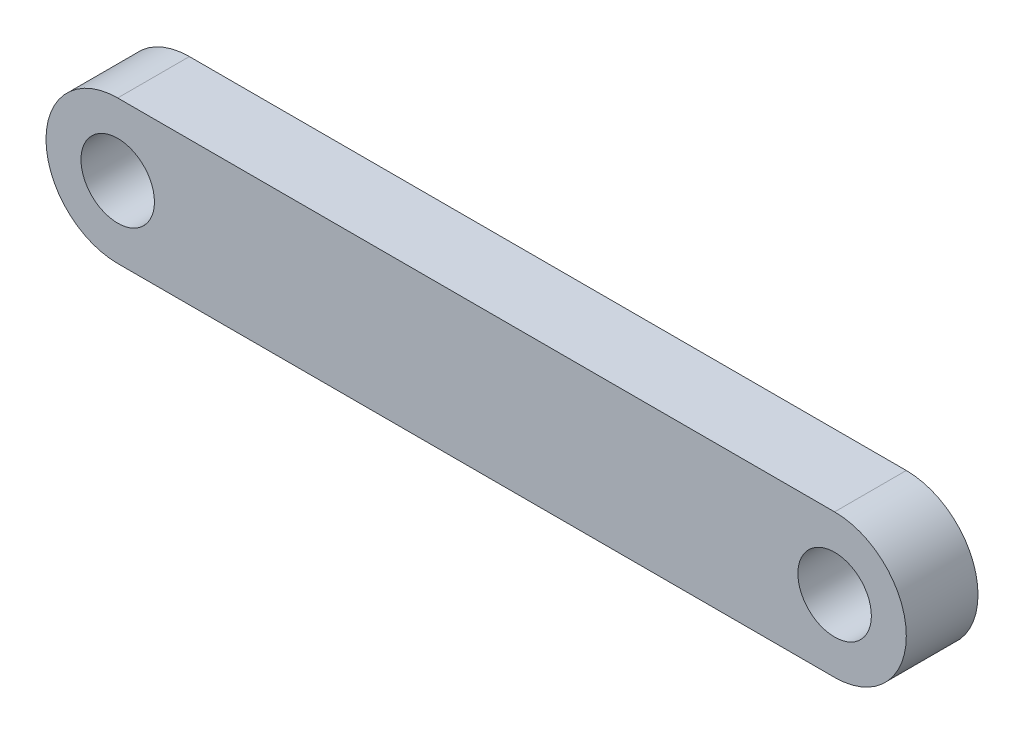
ISO-10303-21;
HEADER;
FILE_DESCRIPTION(('STEP AP214'),'2;1');
FILE_NAME('part.step','',(''),(''),'','','');
FILE_SCHEMA(('AUTOMOTIVE_DESIGN { 1 0 10303 214 1 1 1 1 }'));
ENDSEC;
DATA;
#1=APPLICATION_CONTEXT('core data for automotive mechanical design processes');
#2=APPLICATION_PROTOCOL_DEFINITION('international standard','automotive_design',2000,#1);
#3=PRODUCT_CONTEXT('',#1,'mechanical');
#4=PRODUCT('Part','Part','',(#3));
#5=PRODUCT_RELATED_PRODUCT_CATEGORY('part','',(#4));
#6=PRODUCT_DEFINITION_FORMATION('','',#4);
#7=PRODUCT_DEFINITION_CONTEXT('part definition',#1,'design');
#8=PRODUCT_DEFINITION('design','',#6,#7);
#9=PRODUCT_DEFINITION_SHAPE('','',#8);
#10=(LENGTH_UNIT() NAMED_UNIT(*) SI_UNIT(.MILLI.,.METRE.));
#11=(NAMED_UNIT(*) PLANE_ANGLE_UNIT() SI_UNIT($,.RADIAN.));
#12=(NAMED_UNIT(*) SI_UNIT($,.STERADIAN.) SOLID_ANGLE_UNIT());
#13=UNCERTAINTY_MEASURE_WITH_UNIT(LENGTH_MEASURE(1.E-05),#10,'distance_accuracy_value','');
#14=(GEOMETRIC_REPRESENTATION_CONTEXT(3) GLOBAL_UNCERTAINTY_ASSIGNED_CONTEXT((#13)) GLOBAL_UNIT_ASSIGNED_CONTEXT((#10,
#11,#12)) REPRESENTATION_CONTEXT('',''));
#15=CARTESIAN_POINT('',(0.,0.,0.));
#16=DIRECTION('',(0.,0.,1.));
#17=DIRECTION('',(1.,0.,0.));
#18=AXIS2_PLACEMENT_3D('',#15,#16,#17);
#19=CARTESIAN_POINT('',(0.,0.,4.));
#20=DIRECTION('',(0.,0.,1.));
#21=DIRECTION('',(1.,0.,0.));
#22=AXIS2_PLACEMENT_3D('',#19,#20,#21);
#23=PLANE('',#22);
#24=CARTESIAN_POINT('',(0.,0.,4.));
#25=DIRECTION('',(0.,0.,1.));
#26=DIRECTION('',(1.,0.,0.));
#27=AXIS2_PLACEMENT_3D('',#24,#25,#26);
#28=CIRCLE('',#27,2.05);
#29=CARTESIAN_POINT('',(2.05,0.,4.));
#30=VERTEX_POINT('',#29);
#31=EDGE_CURVE('E100',#30,#30,#28,.T.);
#32=ORIENTED_EDGE('',*,*,#31,.F.);
#33=EDGE_LOOP('',(#32));
#34=FACE_BOUND('',#33,.T.);
#35=CARTESIAN_POINT('',(0.,0.,4.));
#36=DIRECTION('',(0.,0.,1.));
#37=DIRECTION('',(1.,0.,0.));
#38=AXIS2_PLACEMENT_3D('',#35,#36,#37);
#39=CIRCLE('',#38,4.);
#40=CARTESIAN_POINT('',(0.,4.,4.));
#41=VERTEX_POINT('',#40);
#42=CARTESIAN_POINT('',(0.,-4.,4.));
#43=VERTEX_POINT('',#42);
#44=EDGE_CURVE('E85',#41,#43,#39,.T.);
#45=ORIENTED_EDGE('',*,*,#44,.T.);
#46=DIRECTION('',(1.,0.,0.));
#47=VECTOR('',#46,1.);
#48=CARTESIAN_POINT('',(0.,-4.,4.));
#49=LINE('',#48,#47);
#50=CARTESIAN_POINT('',(40.,-4.,4.));
#51=VERTEX_POINT('',#50);
#52=EDGE_CURVE('E80',#43,#51,#49,.T.);
#53=ORIENTED_EDGE('',*,*,#52,.T.);
#54=CARTESIAN_POINT('',(40.,0.,4.));
#55=DIRECTION('',(0.,0.,1.));
#56=DIRECTION('',(1.,0.,0.));
#57=AXIS2_PLACEMENT_3D('',#54,#55,#56);
#58=CIRCLE('',#57,4.);
#59=CARTESIAN_POINT('',(40.,4.,4.));
#60=VERTEX_POINT('',#59);
#61=EDGE_CURVE('E83',#51,#60,#58,.T.);
#62=ORIENTED_EDGE('',*,*,#61,.T.);
#63=DIRECTION('',(-1.,0.,0.));
#64=VECTOR('',#63,1.);
#65=CARTESIAN_POINT('',(0.,4.,4.));
#66=LINE('',#65,#64);
#67=EDGE_CURVE('E50',#60,#41,#66,.T.);
#68=ORIENTED_EDGE('',*,*,#67,.T.);
#69=EDGE_LOOP('',(#45,#53,#62,#68));
#70=FACE_BOUND('',#69,.T.);
#71=CARTESIAN_POINT('',(40.,0.,4.));
#72=DIRECTION('',(0.,0.,1.));
#73=DIRECTION('',(1.,0.,0.));
#74=AXIS2_PLACEMENT_3D('',#71,#72,#73);
#75=CIRCLE('',#74,2.05);
#76=CARTESIAN_POINT('',(42.05,0.,4.));
#77=VERTEX_POINT('',#76);
#78=EDGE_CURVE('E115',#77,#77,#75,.T.);
#79=ORIENTED_EDGE('',*,*,#78,.F.);
#80=EDGE_LOOP('',(#79));
#81=FACE_BOUND('',#80,.T.);
#82=ADVANCED_FACE('F33',(#34,#70,#81),#23,.T.);
#83=CARTESIAN_POINT('',(0.,0.,0.));
#84=DIRECTION('',(0.,0.,1.));
#85=DIRECTION('',(1.,0.,0.));
#86=AXIS2_PLACEMENT_3D('',#83,#84,#85);
#87=PLANE('',#86);
#88=CARTESIAN_POINT('',(0.,0.,0.));
#89=DIRECTION('',(0.,0.,1.));
#90=DIRECTION('',(1.,0.,0.));
#91=AXIS2_PLACEMENT_3D('',#88,#89,#90);
#92=CIRCLE('',#91,4.);
#93=CARTESIAN_POINT('',(0.,4.,0.));
#94=VERTEX_POINT('',#93);
#95=CARTESIAN_POINT('',(0.,-4.,0.));
#96=VERTEX_POINT('',#95);
#97=EDGE_CURVE('E97',#94,#96,#92,.T.);
#98=ORIENTED_EDGE('',*,*,#97,.F.);
#99=DIRECTION('',(-1.,0.,0.));
#100=VECTOR('',#99,1.);
#101=CARTESIAN_POINT('',(0.,4.,0.));
#102=LINE('',#101,#100);
#103=CARTESIAN_POINT('',(40.,4.,0.));
#104=VERTEX_POINT('',#103);
#105=EDGE_CURVE('E73',#104,#94,#102,.T.);
#106=ORIENTED_EDGE('',*,*,#105,.F.);
#107=CARTESIAN_POINT('',(40.,0.,0.));
#108=DIRECTION('',(0.,0.,1.));
#109=DIRECTION('',(1.,0.,0.));
#110=AXIS2_PLACEMENT_3D('',#107,#108,#109);
#111=CIRCLE('',#110,4.);
#112=CARTESIAN_POINT('',(40.,-4.,0.));
#113=VERTEX_POINT('',#112);
#114=EDGE_CURVE('E67',#113,#104,#111,.T.);
#115=ORIENTED_EDGE('',*,*,#114,.F.);
#116=DIRECTION('',(1.,0.,0.));
#117=VECTOR('',#116,1.);
#118=CARTESIAN_POINT('',(0.,-4.,0.));
#119=LINE('',#118,#117);
#120=EDGE_CURVE('E89',#96,#113,#119,.T.);
#121=ORIENTED_EDGE('',*,*,#120,.F.);
#122=EDGE_LOOP('',(#98,#106,#115,#121));
#123=FACE_BOUND('',#122,.T.);
#124=CARTESIAN_POINT('',(0.,0.,0.));
#125=DIRECTION('',(0.,0.,1.));
#126=DIRECTION('',(1.,0.,0.));
#127=AXIS2_PLACEMENT_3D('',#124,#125,#126);
#128=CIRCLE('',#127,2.05);
#129=CARTESIAN_POINT('',(2.05,0.,0.));
#130=VERTEX_POINT('',#129);
#131=EDGE_CURVE('E112',#130,#130,#128,.T.);
#132=ORIENTED_EDGE('',*,*,#131,.T.);
#133=EDGE_LOOP('',(#132));
#134=FACE_BOUND('',#133,.T.);
#135=CARTESIAN_POINT('',(40.,0.,0.));
#136=DIRECTION('',(0.,0.,1.));
#137=DIRECTION('',(1.,0.,0.));
#138=AXIS2_PLACEMENT_3D('',#135,#136,#137);
#139=CIRCLE('',#138,2.05);
#140=CARTESIAN_POINT('',(42.05,0.,0.));
#141=VERTEX_POINT('',#140);
#142=EDGE_CURVE('E118',#141,#141,#139,.T.);
#143=ORIENTED_EDGE('',*,*,#142,.T.);
#144=EDGE_LOOP('',(#143));
#145=FACE_BOUND('',#144,.T.);
#146=ADVANCED_FACE('F108',(#123,#134,#145),#87,.F.);
#147=CARTESIAN_POINT('',(0.,0.,4.));
#148=DIRECTION('',(0.,0.,-1.));
#149=DIRECTION('',(-1.,0.,0.));
#150=AXIS2_PLACEMENT_3D('',#147,#148,#149);
#151=CYLINDRICAL_SURFACE('',#150,4.);
#152=ORIENTED_EDGE('',*,*,#97,.T.);
#153=DIRECTION('',(0.,0.,-1.));
#154=VECTOR('',#153,1.);
#155=CARTESIAN_POINT('',(0.,-4.,4.));
#156=LINE('',#155,#154);
#157=EDGE_CURVE('E11',#43,#96,#156,.T.);
#158=ORIENTED_EDGE('',*,*,#157,.F.);
#159=ORIENTED_EDGE('',*,*,#44,.F.);
#160=DIRECTION('',(0.,0.,-1.));
#161=VECTOR('',#160,1.);
#162=CARTESIAN_POINT('',(0.,4.,4.));
#163=LINE('',#162,#161);
#164=EDGE_CURVE('E93',#41,#94,#163,.T.);
#165=ORIENTED_EDGE('',*,*,#164,.T.);
#166=EDGE_LOOP('',(#152,#158,#159,#165));
#167=FACE_BOUND('',#166,.T.);
#168=ADVANCED_FACE('F35',(#167),#151,.T.);
#169=CARTESIAN_POINT('',(0.,-4.,4.));
#170=DIRECTION('',(0.,1.,0.));
#171=DIRECTION('',(0.,0.,1.));
#172=AXIS2_PLACEMENT_3D('',#169,#170,#171);
#173=PLANE('',#172);
#174=ORIENTED_EDGE('',*,*,#120,.T.);
#175=DIRECTION('',(0.,0.,-1.));
#176=VECTOR('',#175,1.);
#177=CARTESIAN_POINT('',(40.,-4.,4.));
#178=LINE('',#177,#176);
#179=EDGE_CURVE('E42',#51,#113,#178,.T.);
#180=ORIENTED_EDGE('',*,*,#179,.F.);
#181=ORIENTED_EDGE('',*,*,#52,.F.);
#182=ORIENTED_EDGE('',*,*,#157,.T.);
#183=EDGE_LOOP('',(#174,#180,#181,#182));
#184=FACE_BOUND('',#183,.T.);
#185=ADVANCED_FACE('F88',(#184),#173,.F.);
#186=CARTESIAN_POINT('',(40.,0.,4.));
#187=DIRECTION('',(0.,0.,-1.));
#188=DIRECTION('',(-1.,0.,0.));
#189=AXIS2_PLACEMENT_3D('',#186,#187,#188);
#190=CYLINDRICAL_SURFACE('',#189,4.);
#191=ORIENTED_EDGE('',*,*,#114,.T.);
#192=DIRECTION('',(0.,0.,-1.));
#193=VECTOR('',#192,1.);
#194=CARTESIAN_POINT('',(40.,4.,4.));
#195=LINE('',#194,#193);
#196=EDGE_CURVE('E90',#60,#104,#195,.T.);
#197=ORIENTED_EDGE('',*,*,#196,.F.);
#198=ORIENTED_EDGE('',*,*,#61,.F.);
#199=ORIENTED_EDGE('',*,*,#179,.T.);
#200=EDGE_LOOP('',(#191,#197,#198,#199));
#201=FACE_BOUND('',#200,.T.);
#202=ADVANCED_FACE('F91',(#201),#190,.T.);
#203=CARTESIAN_POINT('',(0.,4.,4.));
#204=DIRECTION('',(0.,-1.,0.));
#205=DIRECTION('',(0.,0.,-1.));
#206=AXIS2_PLACEMENT_3D('',#203,#204,#205);
#207=PLANE('',#206);
#208=ORIENTED_EDGE('',*,*,#105,.T.);
#209=ORIENTED_EDGE('',*,*,#164,.F.);
#210=ORIENTED_EDGE('',*,*,#67,.F.);
#211=ORIENTED_EDGE('',*,*,#196,.T.);
#212=EDGE_LOOP('',(#208,#209,#210,#211));
#213=FACE_BOUND('',#212,.T.);
#214=ADVANCED_FACE('F105',(#213),#207,.F.);
#215=CARTESIAN_POINT('',(0.,0.,4.));
#216=DIRECTION('',(0.,0.,-1.));
#217=DIRECTION('',(-1.,0.,0.));
#218=AXIS2_PLACEMENT_3D('',#215,#216,#217);
#219=CYLINDRICAL_SURFACE('',#218,2.05);
#220=ORIENTED_EDGE('',*,*,#31,.T.);
#221=EDGE_LOOP('',(#220));
#222=FACE_BOUND('',#221,.T.);
#223=ORIENTED_EDGE('',*,*,#131,.F.);
#224=EDGE_LOOP('',(#223));
#225=FACE_BOUND('',#224,.T.);
#226=ADVANCED_FACE('F135',(#222,#225),#219,.F.);
#227=CARTESIAN_POINT('',(40.,0.,4.));
#228=DIRECTION('',(0.,0.,-1.));
#229=DIRECTION('',(-1.,0.,0.));
#230=AXIS2_PLACEMENT_3D('',#227,#228,#229);
#231=CYLINDRICAL_SURFACE('',#230,2.05);
#232=ORIENTED_EDGE('',*,*,#78,.T.);
#233=EDGE_LOOP('',(#232));
#234=FACE_BOUND('',#233,.T.);
#235=ORIENTED_EDGE('',*,*,#142,.F.);
#236=EDGE_LOOP('',(#235));
#237=FACE_BOUND('',#236,.T.);
#238=ADVANCED_FACE('F124',(#234,#237),#231,.F.);
#239=CLOSED_SHELL('',(#82,#146,#168,#185,#202,#214,#226,#238));
#240=MANIFOLD_SOLID_BREP('B2',#239);
#241=ADVANCED_BREP_SHAPE_REPRESENTATION('',(#18,#240),#14);
#242=SHAPE_DEFINITION_REPRESENTATION(#9,#241);
ENDSEC;
END-ISO-10303-21;
